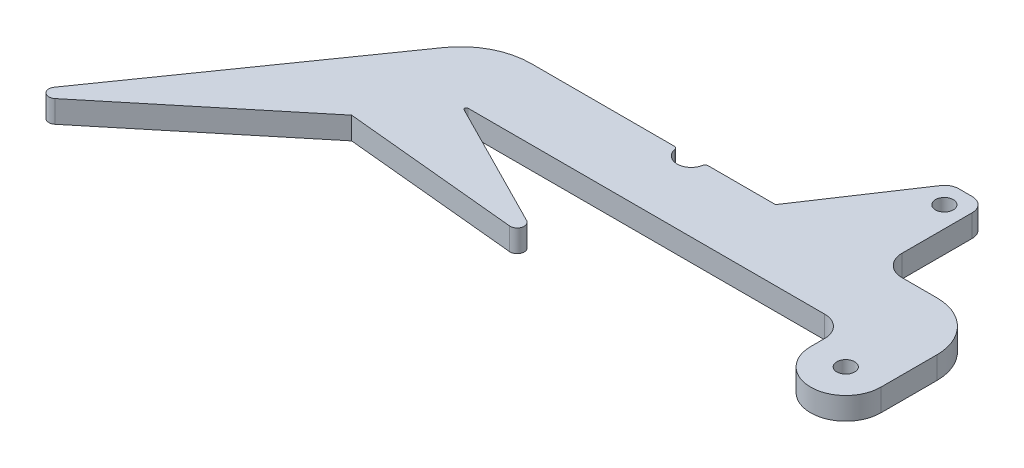
ISO-10303-21;
HEADER;
FILE_DESCRIPTION(('STEP AP214'),'2;1');
FILE_NAME('part.step','',(''),(''),'','','');
FILE_SCHEMA(('AUTOMOTIVE_DESIGN { 1 0 10303 214 1 1 1 1 }'));
ENDSEC;
DATA;
#1=APPLICATION_CONTEXT('core data for automotive mechanical design processes');
#2=APPLICATION_PROTOCOL_DEFINITION('international standard','automotive_design',2000,#1);
#3=PRODUCT_CONTEXT('',#1,'mechanical');
#4=PRODUCT('Part','Part','',(#3));
#5=PRODUCT_RELATED_PRODUCT_CATEGORY('part','',(#4));
#6=PRODUCT_DEFINITION_FORMATION('','',#4);
#7=PRODUCT_DEFINITION_CONTEXT('part definition',#1,'design');
#8=PRODUCT_DEFINITION('design','',#6,#7);
#9=PRODUCT_DEFINITION_SHAPE('','',#8);
#10=(LENGTH_UNIT() NAMED_UNIT(*) SI_UNIT(.MILLI.,.METRE.));
#11=(NAMED_UNIT(*) PLANE_ANGLE_UNIT() SI_UNIT($,.RADIAN.));
#12=(NAMED_UNIT(*) SI_UNIT($,.STERADIAN.) SOLID_ANGLE_UNIT());
#13=UNCERTAINTY_MEASURE_WITH_UNIT(LENGTH_MEASURE(1.E-05),#10,'distance_accuracy_value','');
#14=(GEOMETRIC_REPRESENTATION_CONTEXT(3) GLOBAL_UNCERTAINTY_ASSIGNED_CONTEXT((#13)) GLOBAL_UNIT_ASSIGNED_CONTEXT((#10,
#11,#12)) REPRESENTATION_CONTEXT('',''));
#15=CARTESIAN_POINT('',(0.,0.,0.));
#16=DIRECTION('',(0.,0.,1.));
#17=DIRECTION('',(1.,0.,0.));
#18=AXIS2_PLACEMENT_3D('',#15,#16,#17);
#19=CARTESIAN_POINT('',(-30.,3.175,0.));
#20=DIRECTION('',(0.,0.,1.));
#21=DIRECTION('',(1.,0.,0.));
#22=AXIS2_PLACEMENT_3D('',#19,#20,#21);
#23=PLANE('',#22);
#24=DIRECTION('',(-1.,0.,0.));
#25=VECTOR('',#24,1.);
#26=CARTESIAN_POINT('',(-30.,0.,0.));
#27=LINE('',#26,#25);
#28=CARTESIAN_POINT('',(-30.,0.,0.));
#29=VERTEX_POINT('',#28);
#30=CARTESIAN_POINT('',(-39.5505102572168,0.,0.));
#31=VERTEX_POINT('',#30);
#32=EDGE_CURVE('E413',#29,#31,#27,.T.);
#33=ORIENTED_EDGE('',*,*,#32,.T.);
#34=DIRECTION('',(0.,1.,0.));
#35=VECTOR('',#34,1.);
#36=CARTESIAN_POINT('',(-39.5505102572168,3.175,0.));
#37=LINE('',#36,#35);
#38=CARTESIAN_POINT('',(-39.5505102572168,3.175,0.));
#39=VERTEX_POINT('',#38);
#40=EDGE_CURVE('E218',#31,#39,#37,.T.);
#41=ORIENTED_EDGE('',*,*,#40,.T.);
#42=DIRECTION('',(-1.,0.,0.));
#43=VECTOR('',#42,1.);
#44=CARTESIAN_POINT('',(-30.,3.175,0.));
#45=LINE('',#44,#43);
#46=CARTESIAN_POINT('',(-30.,3.175,0.));
#47=VERTEX_POINT('',#46);
#48=EDGE_CURVE('E211',#47,#39,#45,.T.);
#49=ORIENTED_EDGE('',*,*,#48,.F.);
#50=DIRECTION('',(0.,-1.,0.));
#51=VECTOR('',#50,1.);
#52=CARTESIAN_POINT('',(-30.,3.175,0.));
#53=LINE('',#52,#51);
#54=EDGE_CURVE('E215',#47,#29,#53,.T.);
#55=ORIENTED_EDGE('',*,*,#54,.T.);
#56=EDGE_LOOP('',(#33,#41,#49,#55));
#57=FACE_BOUND('',#56,.T.);
#58=ADVANCED_FACE('F37',(#57),#23,.F.);
#59=CARTESIAN_POINT('',(-30.,3.175,0.));
#60=DIRECTION('',(0.832050294337844,0.,0.554700196225229));
#61=DIRECTION('',(0.554700196225229,0.,-0.832050294337844));
#62=AXIS2_PLACEMENT_3D('',#59,#60,#61);
#63=PLANE('',#62);
#64=DIRECTION('',(-0.554700196225229,0.,0.832050294337844));
#65=VECTOR('',#64,1.);
#66=CARTESIAN_POINT('',(-30.,0.,0.));
#67=LINE('',#66,#65);
#68=CARTESIAN_POINT('',(-20.5937330716997,0.,-14.1094003924505));
#69=VERTEX_POINT('',#68);
#70=EDGE_CURVE('E237',#69,#29,#67,.T.);
#71=ORIENTED_EDGE('',*,*,#70,.T.);
#72=ORIENTED_EDGE('',*,*,#54,.F.);
#73=DIRECTION('',(-0.554700196225229,0.,0.832050294337844));
#74=VECTOR('',#73,1.);
#75=CARTESIAN_POINT('',(-30.,3.175,0.));
#76=LINE('',#75,#74);
#77=CARTESIAN_POINT('',(-20.5937330716997,3.175,-14.1094003924505));
#78=VERTEX_POINT('',#77);
#79=EDGE_CURVE('E224',#78,#47,#76,.T.);
#80=ORIENTED_EDGE('',*,*,#79,.F.);
#81=DIRECTION('',(0.,-1.,0.));
#82=VECTOR('',#81,1.);
#83=CARTESIAN_POINT('',(-20.5937330716997,3.175,-14.1094003924505));
#84=LINE('',#83,#82);
#85=EDGE_CURVE('E326',#78,#69,#84,.T.);
#86=ORIENTED_EDGE('',*,*,#85,.T.);
#87=EDGE_LOOP('',(#71,#72,#80,#86));
#88=FACE_BOUND('',#87,.T.);
#89=ADVANCED_FACE('F235',(#88),#63,.F.);
#90=CARTESIAN_POINT('',(-44.4494897427832,3.175,0.));
#91=VERTEX_POINT('',#90);
#92=CARTESIAN_POINT('',(-64.7943294944825,3.175,0.));
#93=VERTEX_POINT('',#92);
#94=EDGE_CURVE('E221',#91,#93,#45,.T.);
#95=ORIENTED_EDGE('',*,*,#94,.F.);
#96=DIRECTION('',(0.,1.,0.));
#97=VECTOR('',#96,1.);
#98=CARTESIAN_POINT('',(-44.4494897427832,3.175,0.));
#99=LINE('',#98,#97);
#100=CARTESIAN_POINT('',(-44.4494897427832,0.,0.));
#101=VERTEX_POINT('',#100);
#102=EDGE_CURVE('E288',#91,#101,#99,.F.);
#103=ORIENTED_EDGE('',*,*,#102,.T.);
#104=CARTESIAN_POINT('',(-64.7943294944825,0.,0.));
#105=VERTEX_POINT('',#104);
#106=EDGE_CURVE('E411',#101,#105,#27,.T.);
#107=ORIENTED_EDGE('',*,*,#106,.T.);
#108=DIRECTION('',(0.,-1.,0.));
#109=VECTOR('',#108,1.);
#110=CARTESIAN_POINT('',(-64.7943294944825,3.175,0.));
#111=LINE('',#110,#109);
#112=EDGE_CURVE('E251',#105,#93,#111,.F.);
#113=ORIENTED_EDGE('',*,*,#112,.T.);
#114=EDGE_LOOP('',(#95,#103,#107,#113));
#115=FACE_BOUND('',#114,.T.);
#116=ADVANCED_FACE('F480',(#115),#23,.F.);
#117=CARTESIAN_POINT('',(-70.,3.175,0.));
#118=DIRECTION('',(0.819152044288993,0.,0.573576436351044));
#119=DIRECTION('',(0.573576436351044,0.,-0.819152044288994));
#120=AXIS2_PLACEMENT_3D('',#117,#118,#119);
#121=PLANE('',#120);
#122=DIRECTION('',(-0.573576436351044,0.,0.819152044288993));
#123=VECTOR('',#122,1.);
#124=CARTESIAN_POINT('',(-70.,3.175,0.));
#125=LINE('',#124,#123);
#126=CARTESIAN_POINT('',(-72.9858499373725,3.175,4.26423563648957));
#127=VERTEX_POINT('',#126);
#128=CARTESIAN_POINT('',(-95.810939635797,3.175,36.8618419930047));
#129=VERTEX_POINT('',#128);
#130=EDGE_CURVE('E220',#127,#129,#125,.T.);
#131=ORIENTED_EDGE('',*,*,#130,.F.);
#132=DIRECTION('',(0.,-1.,0.));
#133=VECTOR('',#132,1.);
#134=CARTESIAN_POINT('',(-72.9858499373725,3.175,4.26423563648957));
#135=LINE('',#134,#133);
#136=CARTESIAN_POINT('',(-72.9858499373725,0.,4.26423563648957));
#137=VERTEX_POINT('',#136);
#138=EDGE_CURVE('E238',#127,#137,#135,.T.);
#139=ORIENTED_EDGE('',*,*,#138,.T.);
#140=DIRECTION('',(-0.573576436351044,0.,0.819152044288993));
#141=VECTOR('',#140,1.);
#142=CARTESIAN_POINT('',(-70.,0.,0.));
#143=LINE('',#142,#141);
#144=CARTESIAN_POINT('',(-95.810939635797,0.,36.8618419930047));
#145=VERTEX_POINT('',#144);
#146=EDGE_CURVE('E370',#137,#145,#143,.T.);
#147=ORIENTED_EDGE('',*,*,#146,.T.);
#148=DIRECTION('',(0.,-1.,0.));
#149=VECTOR('',#148,1.);
#150=CARTESIAN_POINT('',(-95.810939635797,3.175,36.8618419930047));
#151=LINE('',#150,#149);
#152=EDGE_CURVE('E239',#129,#145,#151,.T.);
#153=ORIENTED_EDGE('',*,*,#152,.F.);
#154=EDGE_LOOP('',(#131,#139,#147,#153));
#155=FACE_BOUND('',#154,.T.);
#156=ADVANCED_FACE('F417',(#155),#121,.F.);
#157=CARTESIAN_POINT('',(-94.991787591508,3.175,37.4354184293557));
#158=DIRECTION('',(0.,-1.,0.));
#159=DIRECTION('',(0.,0.,-1.));
#160=AXIS2_PLACEMENT_3D('',#157,#158,#159);
#161=CYLINDRICAL_SURFACE('',#160,0.999999999999989);
#162=CARTESIAN_POINT('',(-94.991787591508,0.,37.4354184293557));
#163=DIRECTION('',(0.,1.,0.));
#164=DIRECTION('',(0.,0.,-1.));
#165=AXIS2_PLACEMENT_3D('',#162,#163,#164);
#166=CIRCLE('',#165,0.999999999999989);
#167=CARTESIAN_POINT('',(-94.3562273209506,0.,38.2074696857429));
#168=VERTEX_POINT('',#167);
#169=EDGE_CURVE('E364',#145,#168,#166,.T.);
#170=ORIENTED_EDGE('',*,*,#169,.T.);
#171=DIRECTION('',(0.,-1.,0.));
#172=VECTOR('',#171,1.);
#173=CARTESIAN_POINT('',(-94.3562273209506,3.175,38.2074696857429));
#174=LINE('',#173,#172);
#175=CARTESIAN_POINT('',(-94.3562273209506,3.175,38.2074696857429));
#176=VERTEX_POINT('',#175);
#177=EDGE_CURVE('E245',#176,#168,#174,.T.);
#178=ORIENTED_EDGE('',*,*,#177,.F.);
#179=CARTESIAN_POINT('',(-94.991787591508,3.175,37.4354184293557));
#180=DIRECTION('',(0.,1.,0.));
#181=DIRECTION('',(0.,0.,-1.));
#182=AXIS2_PLACEMENT_3D('',#179,#180,#181);
#183=CIRCLE('',#182,0.999999999999989);
#184=EDGE_CURVE('E420',#129,#176,#183,.T.);
#185=ORIENTED_EDGE('',*,*,#184,.F.);
#186=ORIENTED_EDGE('',*,*,#152,.T.);
#187=EDGE_LOOP('',(#170,#178,#185,#186));
#188=FACE_BOUND('',#187,.T.);
#189=ADVANCED_FACE('F419',(#188),#161,.T.);
#190=CARTESIAN_POINT('',(-94.3562273209506,3.175,38.2074696857429));
#191=DIRECTION('',(-0.635560270557382,0.,-0.772051256387183));
#192=DIRECTION('',(-0.772051256387183,0.,0.635560270557382));
#193=AXIS2_PLACEMENT_3D('',#190,#191,#192);
#194=PLANE('',#193);
#195=DIRECTION('',(0.772051256387183,0.,-0.635560270557382));
#196=VECTOR('',#195,1.);
#197=CARTESIAN_POINT('',(-94.3562273209506,0.,38.2074696857429));
#198=LINE('',#197,#196);
#199=CARTESIAN_POINT('',(-71.1946896293351,0.,19.1406615690215));
#200=VERTEX_POINT('',#199);
#201=EDGE_CURVE('E357',#168,#200,#198,.T.);
#202=ORIENTED_EDGE('',*,*,#201,.T.);
#203=DIRECTION('',(0.,-1.,0.));
#204=VECTOR('',#203,1.);
#205=CARTESIAN_POINT('',(-71.1946896293351,3.175,19.1406615690215));
#206=LINE('',#205,#204);
#207=CARTESIAN_POINT('',(-71.1946896293351,3.175,19.1406615690215));
#208=VERTEX_POINT('',#207);
#209=EDGE_CURVE('E348',#208,#200,#206,.T.);
#210=ORIENTED_EDGE('',*,*,#209,.F.);
#211=DIRECTION('',(0.772051256387183,0.,-0.635560270557382));
#212=VECTOR('',#211,1.);
#213=CARTESIAN_POINT('',(-94.3562273209506,3.175,38.2074696857429));
#214=LINE('',#213,#212);
#215=EDGE_CURVE('E358',#176,#208,#214,.T.);
#216=ORIENTED_EDGE('',*,*,#215,.F.);
#217=ORIENTED_EDGE('',*,*,#177,.T.);
#218=EDGE_LOOP('',(#202,#210,#216,#217));
#219=FACE_BOUND('',#218,.T.);
#220=ADVANCED_FACE('F355',(#219),#194,.F.);
#221=CARTESIAN_POINT('',(-71.1946896293351,3.175,19.1406615690215));
#222=DIRECTION('',(0.0965137016510914,0.,-0.995331655978852));
#223=DIRECTION('',(-0.995331655978852,0.,-0.0965137016510914));
#224=AXIS2_PLACEMENT_3D('',#221,#222,#223);
#225=PLANE('',#224);
#226=DIRECTION('',(0.995331655978852,0.,0.0965137016510914));
#227=VECTOR('',#226,1.);
#228=CARTESIAN_POINT('',(-71.1946896293351,0.,19.1406615690215));
#229=LINE('',#228,#227);
#230=CARTESIAN_POINT('',(-46.3113982298638,0.,21.5535041102988));
#231=VERTEX_POINT('',#230);
#232=EDGE_CURVE('E366',#200,#231,#229,.T.);
#233=ORIENTED_EDGE('',*,*,#232,.T.);
#234=DIRECTION('',(0.,-1.,0.));
#235=VECTOR('',#234,1.);
#236=CARTESIAN_POINT('',(-46.3113982298638,3.175,21.5535041102988));
#237=LINE('',#236,#235);
#238=CARTESIAN_POINT('',(-46.3113982298638,3.175,21.5535041102988));
#239=VERTEX_POINT('',#238);
#240=EDGE_CURVE('E345',#239,#231,#237,.T.);
#241=ORIENTED_EDGE('',*,*,#240,.F.);
#242=DIRECTION('',(0.995331655978852,0.,0.0965137016510914));
#243=VECTOR('',#242,1.);
#244=CARTESIAN_POINT('',(-71.1946896293351,3.175,19.1406615690215));
#245=LINE('',#244,#243);
#246=EDGE_CURVE('E422',#208,#239,#245,.T.);
#247=ORIENTED_EDGE('',*,*,#246,.F.);
#248=ORIENTED_EDGE('',*,*,#209,.T.);
#249=EDGE_LOOP('',(#233,#241,#247,#248));
#250=FACE_BOUND('',#249,.T.);
#251=ADVANCED_FACE('F469',(#250),#225,.F.);
#252=CARTESIAN_POINT('',(-46.2148845282127,3.175,20.5581724543199));
#253=DIRECTION('',(0.,-1.,0.));
#254=DIRECTION('',(0.,0.,-1.));
#255=AXIS2_PLACEMENT_3D('',#252,#253,#254);
#256=CYLINDRICAL_SURFACE('',#255,1.);
#257=CARTESIAN_POINT('',(-46.2148845282127,0.,20.5581724543199));
#258=DIRECTION('',(0.,1.,0.));
#259=DIRECTION('',(0.,0.,1.));
#260=AXIS2_PLACEMENT_3D('',#257,#258,#259);
#261=CIRCLE('',#260,1.);
#262=CARTESIAN_POINT('',(-45.7620418507201,0.,19.666582016147));
#263=VERTEX_POINT('',#262);
#264=EDGE_CURVE('E368',#231,#263,#261,.T.);
#265=ORIENTED_EDGE('',*,*,#264,.T.);
#266=DIRECTION('',(0.,-1.,0.));
#267=VECTOR('',#266,1.);
#268=CARTESIAN_POINT('',(-45.7620418507201,3.175,19.666582016147));
#269=LINE('',#268,#267);
#270=CARTESIAN_POINT('',(-45.7620418507201,3.175,19.666582016147));
#271=VERTEX_POINT('',#270);
#272=EDGE_CURVE('E342',#271,#263,#269,.T.);
#273=ORIENTED_EDGE('',*,*,#272,.F.);
#274=CARTESIAN_POINT('',(-46.2148845282127,3.175,20.5581724543199));
#275=DIRECTION('',(0.,1.,0.));
#276=DIRECTION('',(0.,0.,1.));
#277=AXIS2_PLACEMENT_3D('',#274,#275,#276);
#278=CIRCLE('',#277,1.);
#279=EDGE_CURVE('E427',#239,#271,#278,.T.);
#280=ORIENTED_EDGE('',*,*,#279,.F.);
#281=ORIENTED_EDGE('',*,*,#240,.T.);
#282=EDGE_LOOP('',(#265,#273,#280,#281));
#283=FACE_BOUND('',#282,.T.);
#284=ADVANCED_FACE('F465',(#283),#256,.T.);
#285=CARTESIAN_POINT('',(-45.7620418507201,3.175,19.666582016147));
#286=DIRECTION('',(-0.452842677492602,0.,0.891590438172893));
#287=DIRECTION('',(0.891590438172893,0.,0.452842677492602));
#288=AXIS2_PLACEMENT_3D('',#285,#286,#287);
#289=PLANE('',#288);
#290=DIRECTION('',(-0.891590438172893,0.,-0.452842677492602));
#291=VECTOR('',#290,1.);
#292=CARTESIAN_POINT('',(-45.7620418507201,0.,19.666582016147));
#293=LINE('',#292,#291);
#294=CARTESIAN_POINT('',(-63.8632534103154,0.,10.4728976095432));
#295=VERTEX_POINT('',#294);
#296=EDGE_CURVE('E375',#263,#295,#293,.T.);
#297=ORIENTED_EDGE('',*,*,#296,.T.);
#298=DIRECTION('',(0.,-1.,0.));
#299=VECTOR('',#298,1.);
#300=CARTESIAN_POINT('',(-63.8632534103154,3.175,10.4728976095432));
#301=LINE('',#300,#299);
#302=CARTESIAN_POINT('',(-63.8632534103154,3.175,10.4728976095432));
#303=VERTEX_POINT('',#302);
#304=EDGE_CURVE('E259',#295,#303,#301,.F.);
#305=ORIENTED_EDGE('',*,*,#304,.T.);
#306=DIRECTION('',(-0.891590438172893,0.,-0.452842677492602));
#307=VECTOR('',#306,1.);
#308=CARTESIAN_POINT('',(-45.7620418507201,3.175,19.666582016147));
#309=LINE('',#308,#307);
#310=EDGE_CURVE('E429',#271,#303,#309,.T.);
#311=ORIENTED_EDGE('',*,*,#310,.F.);
#312=ORIENTED_EDGE('',*,*,#272,.T.);
#313=EDGE_LOOP('',(#297,#305,#311,#312));
#314=FACE_BOUND('',#313,.T.);
#315=ADVANCED_FACE('F461',(#314),#289,.F.);
#316=CARTESIAN_POINT('',(-64.7943294944825,3.175,10.));
#317=DIRECTION('',(0.,0.,-1.));
#318=DIRECTION('',(-1.,0.,0.));
#319=AXIS2_PLACEMENT_3D('',#316,#317,#318);
#320=PLANE('',#319);
#321=DIRECTION('',(1.,0.,0.));
#322=VECTOR('',#321,1.);
#323=CARTESIAN_POINT('',(-64.7943294944825,0.,10.));
#324=LINE('',#323,#322);
#325=CARTESIAN_POINT('',(-63.7500427409423,0.,10.));
#326=VERTEX_POINT('',#325);
#327=CARTESIAN_POINT('',(-13.,0.,10.));
#328=VERTEX_POINT('',#327);
#329=EDGE_CURVE('E378',#326,#328,#324,.T.);
#330=ORIENTED_EDGE('',*,*,#329,.T.);
#331=DIRECTION('',(0.,-1.,0.));
#332=VECTOR('',#331,1.);
#333=CARTESIAN_POINT('',(-13.,3.175,10.));
#334=LINE('',#333,#332);
#335=CARTESIAN_POINT('',(-13.,3.175,10.));
#336=VERTEX_POINT('',#335);
#337=EDGE_CURVE('E268',#328,#336,#334,.F.);
#338=ORIENTED_EDGE('',*,*,#337,.T.);
#339=DIRECTION('',(1.,0.,0.));
#340=VECTOR('',#339,1.);
#341=CARTESIAN_POINT('',(-64.7943294944825,3.175,10.));
#342=LINE('',#341,#340);
#343=CARTESIAN_POINT('',(-63.7500427409423,3.175,10.));
#344=VERTEX_POINT('',#343);
#345=EDGE_CURVE('E432',#344,#336,#342,.T.);
#346=ORIENTED_EDGE('',*,*,#345,.F.);
#347=DIRECTION('',(0.,-1.,0.));
#348=VECTOR('',#347,1.);
#349=CARTESIAN_POINT('',(-63.7500427409423,0.,10.));
#350=LINE('',#349,#348);
#351=EDGE_CURVE('E256',#344,#326,#350,.T.);
#352=ORIENTED_EDGE('',*,*,#351,.T.);
#353=EDGE_LOOP('',(#330,#338,#346,#352));
#354=FACE_BOUND('',#353,.T.);
#355=ADVANCED_FACE('F452',(#354),#320,.F.);
#356=CARTESIAN_POINT('',(-10.,3.175,10.));
#357=DIRECTION('',(1.,0.,0.));
#358=DIRECTION('',(0.,0.,-1.));
#359=AXIS2_PLACEMENT_3D('',#356,#357,#358);
#360=PLANE('',#359);
#361=DIRECTION('',(0.,0.,1.));
#362=VECTOR('',#361,1.);
#363=CARTESIAN_POINT('',(-10.,3.175,10.));
#364=LINE('',#363,#362);
#365=CARTESIAN_POINT('',(-10.,3.175,13.));
#366=VERTEX_POINT('',#365);
#367=CARTESIAN_POINT('',(-10.,3.175,15.));
#368=VERTEX_POINT('',#367);
#369=EDGE_CURVE('E435',#366,#368,#364,.T.);
#370=ORIENTED_EDGE('',*,*,#369,.F.);
#371=DIRECTION('',(0.,-1.,0.));
#372=VECTOR('',#371,1.);
#373=CARTESIAN_POINT('',(-10.,0.,13.));
#374=LINE('',#373,#372);
#375=CARTESIAN_POINT('',(-10.,0.,13.));
#376=VERTEX_POINT('',#375);
#377=EDGE_CURVE('E265',#366,#376,#374,.T.);
#378=ORIENTED_EDGE('',*,*,#377,.T.);
#379=DIRECTION('',(0.,0.,1.));
#380=VECTOR('',#379,1.);
#381=CARTESIAN_POINT('',(-10.,0.,10.));
#382=LINE('',#381,#380);
#383=CARTESIAN_POINT('',(-10.,0.,15.));
#384=VERTEX_POINT('',#383);
#385=EDGE_CURVE('E381',#376,#384,#382,.T.);
#386=ORIENTED_EDGE('',*,*,#385,.T.);
#387=DIRECTION('',(0.,-1.,0.));
#388=VECTOR('',#387,1.);
#389=CARTESIAN_POINT('',(-10.,3.175,15.));
#390=LINE('',#389,#388);
#391=EDGE_CURVE('E339',#368,#384,#390,.T.);
#392=ORIENTED_EDGE('',*,*,#391,.F.);
#393=EDGE_LOOP('',(#370,#378,#386,#392));
#394=FACE_BOUND('',#393,.T.);
#395=ADVANCED_FACE('F444',(#394),#360,.F.);
#396=CARTESIAN_POINT('',(-5.,3.175,15.));
#397=DIRECTION('',(0.,-1.,0.));
#398=DIRECTION('',(0.,0.,-1.));
#399=AXIS2_PLACEMENT_3D('',#396,#397,#398);
#400=CYLINDRICAL_SURFACE('',#399,5.);
#401=CARTESIAN_POINT('',(-5.,0.,15.));
#402=DIRECTION('',(0.,1.,0.));
#403=DIRECTION('',(0.,0.,-1.));
#404=AXIS2_PLACEMENT_3D('',#401,#402,#403);
#405=CIRCLE('',#404,5.);
#406=CARTESIAN_POINT('',(0.,0.,15.));
#407=VERTEX_POINT('',#406);
#408=EDGE_CURVE('E383',#384,#407,#405,.T.);
#409=ORIENTED_EDGE('',*,*,#408,.T.);
#410=DIRECTION('',(0.,-1.,0.));
#411=VECTOR('',#410,1.);
#412=CARTESIAN_POINT('',(0.,3.175,15.));
#413=LINE('',#412,#411);
#414=CARTESIAN_POINT('',(0.,3.175,15.));
#415=VERTEX_POINT('',#414);
#416=EDGE_CURVE('E336',#415,#407,#413,.T.);
#417=ORIENTED_EDGE('',*,*,#416,.F.);
#418=CARTESIAN_POINT('',(-5.,3.175,15.));
#419=DIRECTION('',(0.,1.,0.));
#420=DIRECTION('',(0.,0.,-1.));
#421=AXIS2_PLACEMENT_3D('',#418,#419,#420);
#422=CIRCLE('',#421,5.);
#423=EDGE_CURVE('E402',#368,#415,#422,.T.);
#424=ORIENTED_EDGE('',*,*,#423,.F.);
#425=ORIENTED_EDGE('',*,*,#391,.T.);
#426=EDGE_LOOP('',(#409,#417,#424,#425));
#427=FACE_BOUND('',#426,.T.);
#428=ADVANCED_FACE('F440',(#427),#400,.T.);
#429=CARTESIAN_POINT('',(0.,3.175,0.));
#430=DIRECTION('',(-1.,0.,0.));
#431=DIRECTION('',(0.,0.,1.));
#432=AXIS2_PLACEMENT_3D('',#429,#430,#431);
#433=PLANE('',#432);
#434=DIRECTION('',(0.,0.,-1.));
#435=VECTOR('',#434,1.);
#436=CARTESIAN_POINT('',(0.,0.,0.));
#437=LINE('',#436,#435);
#438=CARTESIAN_POINT('',(0.,0.,7.));
#439=VERTEX_POINT('',#438);
#440=EDGE_CURVE('E320',#407,#439,#437,.T.);
#441=ORIENTED_EDGE('',*,*,#440,.T.);
#442=DIRECTION('',(0.,-1.,0.));
#443=VECTOR('',#442,1.);
#444=CARTESIAN_POINT('',(0.,3.175,7.));
#445=LINE('',#444,#443);
#446=CARTESIAN_POINT('',(0.,3.175,7.));
#447=VERTEX_POINT('',#446);
#448=EDGE_CURVE('E295',#439,#447,#445,.F.);
#449=ORIENTED_EDGE('',*,*,#448,.T.);
#450=DIRECTION('',(0.,0.,-1.));
#451=VECTOR('',#450,1.);
#452=CARTESIAN_POINT('',(0.,3.175,0.));
#453=LINE('',#452,#451);
#454=EDGE_CURVE('E397',#415,#447,#453,.T.);
#455=ORIENTED_EDGE('',*,*,#454,.F.);
#456=ORIENTED_EDGE('',*,*,#416,.T.);
#457=EDGE_LOOP('',(#441,#449,#455,#456));
#458=FACE_BOUND('',#457,.T.);
#459=ADVANCED_FACE('F388',(#458),#433,.F.);
#460=CARTESIAN_POINT('',(-15.,3.175,0.));
#461=DIRECTION('',(0.,0.,1.));
#462=DIRECTION('',(1.,0.,0.));
#463=AXIS2_PLACEMENT_3D('',#460,#461,#462);
#464=PLANE('',#463);
#465=DIRECTION('',(-1.,0.,0.));
#466=VECTOR('',#465,1.);
#467=CARTESIAN_POINT('',(-15.,0.,0.));
#468=LINE('',#467,#466);
#469=CARTESIAN_POINT('',(-7.,0.,0.));
#470=VERTEX_POINT('',#469);
#471=CARTESIAN_POINT('',(-12.,0.,0.));
#472=VERTEX_POINT('',#471);
#473=EDGE_CURVE('E316',#470,#472,#468,.T.);
#474=ORIENTED_EDGE('',*,*,#473,.T.);
#475=DIRECTION('',(0.,-1.,0.));
#476=VECTOR('',#475,1.);
#477=CARTESIAN_POINT('',(-12.,3.175,0.));
#478=LINE('',#477,#476);
#479=CARTESIAN_POINT('',(-12.,3.175,0.));
#480=VERTEX_POINT('',#479);
#481=EDGE_CURVE('E58',#472,#480,#478,.F.);
#482=ORIENTED_EDGE('',*,*,#481,.T.);
#483=DIRECTION('',(-1.,0.,0.));
#484=VECTOR('',#483,1.);
#485=CARTESIAN_POINT('',(-15.,3.175,0.));
#486=LINE('',#485,#484);
#487=CARTESIAN_POINT('',(-7.,3.175,0.));
#488=VERTEX_POINT('',#487);
#489=EDGE_CURVE('E396',#488,#480,#486,.T.);
#490=ORIENTED_EDGE('',*,*,#489,.F.);
#491=DIRECTION('',(0.,-1.,0.));
#492=VECTOR('',#491,1.);
#493=CARTESIAN_POINT('',(-7.,3.175,0.));
#494=LINE('',#493,#492);
#495=EDGE_CURVE('E290',#488,#470,#494,.T.);
#496=ORIENTED_EDGE('',*,*,#495,.T.);
#497=EDGE_LOOP('',(#474,#482,#490,#496));
#498=FACE_BOUND('',#497,.T.);
#499=ADVANCED_FACE('F398',(#498),#464,.F.);
#500=CARTESIAN_POINT('',(-15.,3.175,0.));
#501=DIRECTION('',(-1.,0.,0.));
#502=DIRECTION('',(0.,0.,1.));
#503=AXIS2_PLACEMENT_3D('',#500,#501,#502);
#504=PLANE('',#503);
#505=DIRECTION('',(0.,0.,-1.));
#506=VECTOR('',#505,1.);
#507=CARTESIAN_POINT('',(-15.,3.175,0.));
#508=LINE('',#507,#506);
#509=CARTESIAN_POINT('',(-15.,3.175,-3.));
#510=VERTEX_POINT('',#509);
#511=CARTESIAN_POINT('',(-15.,3.175,-13.));
#512=VERTEX_POINT('',#511);
#513=EDGE_CURVE('E309',#510,#512,#508,.T.);
#514=ORIENTED_EDGE('',*,*,#513,.F.);
#515=DIRECTION('',(0.,-1.,0.));
#516=VECTOR('',#515,1.);
#517=CARTESIAN_POINT('',(-15.,0.,-3.));
#518=LINE('',#517,#516);
#519=CARTESIAN_POINT('',(-15.,0.,-3.));
#520=VERTEX_POINT('',#519);
#521=EDGE_CURVE('E299',#510,#520,#518,.T.);
#522=ORIENTED_EDGE('',*,*,#521,.T.);
#523=DIRECTION('',(0.,0.,-1.));
#524=VECTOR('',#523,1.);
#525=CARTESIAN_POINT('',(-15.,0.,0.));
#526=LINE('',#525,#524);
#527=CARTESIAN_POINT('',(-15.,0.,-13.));
#528=VERTEX_POINT('',#527);
#529=EDGE_CURVE('E307',#520,#528,#526,.T.);
#530=ORIENTED_EDGE('',*,*,#529,.T.);
#531=DIRECTION('',(0.,-1.,0.));
#532=VECTOR('',#531,1.);
#533=CARTESIAN_POINT('',(-15.,3.175,-13.));
#534=LINE('',#533,#532);
#535=EDGE_CURVE('E334',#512,#528,#534,.T.);
#536=ORIENTED_EDGE('',*,*,#535,.F.);
#537=EDGE_LOOP('',(#514,#522,#530,#536));
#538=FACE_BOUND('',#537,.T.);
#539=ADVANCED_FACE('F305',(#538),#504,.F.);
#540=CARTESIAN_POINT('',(-17.,3.175,-13.));
#541=DIRECTION('',(0.,-1.,0.));
#542=DIRECTION('',(0.,0.,-1.));
#543=AXIS2_PLACEMENT_3D('',#540,#541,#542);
#544=CYLINDRICAL_SURFACE('',#543,2.);
#545=CARTESIAN_POINT('',(-17.,0.,-13.));
#546=DIRECTION('',(0.,1.,0.));
#547=DIRECTION('',(0.,0.,1.));
#548=AXIS2_PLACEMENT_3D('',#545,#546,#547);
#549=CIRCLE('',#548,2.);
#550=CARTESIAN_POINT('',(-17.,0.,-15.));
#551=VERTEX_POINT('',#550);
#552=EDGE_CURVE('E315',#528,#551,#549,.T.);
#553=ORIENTED_EDGE('',*,*,#552,.T.);
#554=DIRECTION('',(0.,-1.,0.));
#555=VECTOR('',#554,1.);
#556=CARTESIAN_POINT('',(-17.,3.175,-15.));
#557=LINE('',#556,#555);
#558=CARTESIAN_POINT('',(-17.,3.175,-15.));
#559=VERTEX_POINT('',#558);
#560=EDGE_CURVE('E331',#559,#551,#557,.T.);
#561=ORIENTED_EDGE('',*,*,#560,.F.);
#562=CARTESIAN_POINT('',(-17.,3.175,-13.));
#563=DIRECTION('',(0.,1.,0.));
#564=DIRECTION('',(0.,0.,1.));
#565=AXIS2_PLACEMENT_3D('',#562,#563,#564);
#566=CIRCLE('',#565,2.);
#567=EDGE_CURVE('E400',#512,#559,#566,.T.);
#568=ORIENTED_EDGE('',*,*,#567,.F.);
#569=ORIENTED_EDGE('',*,*,#535,.T.);
#570=EDGE_LOOP('',(#553,#561,#568,#569));
#571=FACE_BOUND('',#570,.T.);
#572=ADVANCED_FACE('F545',(#571),#544,.T.);
#573=CARTESIAN_POINT('',(-18.929632483024,3.175,-15.));
#574=DIRECTION('',(0.,0.,1.));
#575=DIRECTION('',(1.,0.,0.));
#576=AXIS2_PLACEMENT_3D('',#573,#574,#575);
#577=PLANE('',#576);
#578=DIRECTION('',(-1.,0.,0.));
#579=VECTOR('',#578,1.);
#580=CARTESIAN_POINT('',(-18.929632483024,0.,-15.));
#581=LINE('',#580,#579);
#582=CARTESIAN_POINT('',(-18.929632483024,0.,-15.));
#583=VERTEX_POINT('',#582);
#584=EDGE_CURVE('E318',#551,#583,#581,.T.);
#585=ORIENTED_EDGE('',*,*,#584,.T.);
#586=DIRECTION('',(0.,-1.,0.));
#587=VECTOR('',#586,1.);
#588=CARTESIAN_POINT('',(-18.929632483024,3.175,-15.));
#589=LINE('',#588,#587);
#590=CARTESIAN_POINT('',(-18.929632483024,3.175,-15.));
#591=VERTEX_POINT('',#590);
#592=EDGE_CURVE('E328',#591,#583,#589,.T.);
#593=ORIENTED_EDGE('',*,*,#592,.F.);
#594=DIRECTION('',(-1.,0.,0.));
#595=VECTOR('',#594,1.);
#596=CARTESIAN_POINT('',(-18.929632483024,3.175,-15.));
#597=LINE('',#596,#595);
#598=EDGE_CURVE('E407',#559,#591,#597,.T.);
#599=ORIENTED_EDGE('',*,*,#598,.F.);
#600=ORIENTED_EDGE('',*,*,#560,.T.);
#601=EDGE_LOOP('',(#585,#593,#599,#600));
#602=FACE_BOUND('',#601,.T.);
#603=ADVANCED_FACE('F537',(#602),#577,.F.);
#604=CARTESIAN_POINT('',(-18.929632483024,3.175,-13.));
#605=DIRECTION('',(0.,-1.,0.));
#606=DIRECTION('',(0.,0.,-1.));
#607=AXIS2_PLACEMENT_3D('',#604,#605,#606);
#608=CYLINDRICAL_SURFACE('',#607,2.);
#609=CARTESIAN_POINT('',(-18.929632483024,0.,-13.));
#610=DIRECTION('',(0.,1.,0.));
#611=DIRECTION('',(0.,0.,1.));
#612=AXIS2_PLACEMENT_3D('',#609,#610,#611);
#613=CIRCLE('',#612,2.);
#614=EDGE_CURVE('E233',#583,#69,#613,.T.);
#615=ORIENTED_EDGE('',*,*,#614,.T.);
#616=ORIENTED_EDGE('',*,*,#85,.F.);
#617=CARTESIAN_POINT('',(-18.929632483024,3.175,-13.));
#618=DIRECTION('',(0.,1.,0.));
#619=DIRECTION('',(0.,0.,1.));
#620=AXIS2_PLACEMENT_3D('',#617,#618,#619);
#621=CIRCLE('',#620,2.);
#622=EDGE_CURVE('E229',#591,#78,#621,.T.);
#623=ORIENTED_EDGE('',*,*,#622,.F.);
#624=ORIENTED_EDGE('',*,*,#592,.T.);
#625=EDGE_LOOP('',(#615,#616,#623,#624));
#626=FACE_BOUND('',#625,.T.);
#627=ADVANCED_FACE('F529',(#626),#608,.T.);
#628=CARTESIAN_POINT('',(-18.929632483024,3.175,-13.));
#629=DIRECTION('',(0.,1.,0.));
#630=DIRECTION('',(0.,0.,1.));
#631=AXIS2_PLACEMENT_3D('',#628,#629,#630);
#632=PLANE('',#631);
#633=ORIENTED_EDGE('',*,*,#454,.T.);
#634=CARTESIAN_POINT('',(-7.,3.175,7.));
#635=DIRECTION('',(0.,1.,0.));
#636=DIRECTION('',(0.,0.,1.));
#637=AXIS2_PLACEMENT_3D('',#634,#635,#636);
#638=CIRCLE('',#637,7.);
#639=EDGE_CURVE('E297',#447,#488,#638,.T.);
#640=ORIENTED_EDGE('',*,*,#639,.T.);
#641=ORIENTED_EDGE('',*,*,#489,.T.);
#642=CARTESIAN_POINT('',(-12.,3.175,-3.));
#643=DIRECTION('',(0.,1.,0.));
#644=DIRECTION('',(0.,0.,1.));
#645=AXIS2_PLACEMENT_3D('',#642,#643,#644);
#646=CIRCLE('',#645,3.);
#647=EDGE_CURVE('E11',#480,#510,#646,.F.);
#648=ORIENTED_EDGE('',*,*,#647,.T.);
#649=ORIENTED_EDGE('',*,*,#513,.T.);
#650=ORIENTED_EDGE('',*,*,#567,.T.);
#651=ORIENTED_EDGE('',*,*,#598,.T.);
#652=ORIENTED_EDGE('',*,*,#622,.T.);
#653=ORIENTED_EDGE('',*,*,#79,.T.);
#654=ORIENTED_EDGE('',*,*,#48,.T.);
#655=CARTESIAN_POINT('',(-39.5505102572168,3.175,0.500000000000002));
#656=DIRECTION('',(0.,1.,0.));
#657=DIRECTION('',(0.,0.,1.));
#658=AXIS2_PLACEMENT_3D('',#655,#656,#657);
#659=CIRCLE('',#658,0.5);
#660=CARTESIAN_POINT('',(-40.0404082057735,3.175,0.400000000000002));
#661=VERTEX_POINT('',#660);
#662=EDGE_CURVE('E277',#39,#661,#659,.T.);
#663=ORIENTED_EDGE('',*,*,#662,.T.);
#664=CARTESIAN_POINT('',(-42.,3.175,0.));
#665=DIRECTION('',(0.,1.,0.));
#666=DIRECTION('',(0.,0.,-1.));
#667=AXIS2_PLACEMENT_3D('',#664,#665,#666);
#668=CIRCLE('',#667,2.);
#669=CARTESIAN_POINT('',(-43.9595917942265,3.175,0.400000000000003));
#670=VERTEX_POINT('',#669);
#671=EDGE_CURVE('E510',#670,#661,#668,.T.);
#672=ORIENTED_EDGE('',*,*,#671,.F.);
#673=CARTESIAN_POINT('',(-44.4494897427832,3.175,0.500000000000003));
#674=DIRECTION('',(0.,1.,0.));
#675=DIRECTION('',(0.,0.,1.));
#676=AXIS2_PLACEMENT_3D('',#673,#674,#675);
#677=CIRCLE('',#676,0.5);
#678=EDGE_CURVE('E275',#670,#91,#677,.T.);
#679=ORIENTED_EDGE('',*,*,#678,.T.);
#680=ORIENTED_EDGE('',*,*,#94,.T.);
#681=CARTESIAN_POINT('',(-64.7943294944825,3.175,10.));
#682=DIRECTION('',(0.,1.,0.));
#683=DIRECTION('',(0.,0.,1.));
#684=AXIS2_PLACEMENT_3D('',#681,#682,#683);
#685=CIRCLE('',#684,10.);
#686=EDGE_CURVE('E254',#93,#127,#685,.T.);
#687=ORIENTED_EDGE('',*,*,#686,.T.);
#688=ORIENTED_EDGE('',*,*,#130,.T.);
#689=ORIENTED_EDGE('',*,*,#184,.T.);
#690=ORIENTED_EDGE('',*,*,#215,.T.);
#691=ORIENTED_EDGE('',*,*,#246,.T.);
#692=ORIENTED_EDGE('',*,*,#279,.T.);
#693=ORIENTED_EDGE('',*,*,#310,.T.);
#694=CARTESIAN_POINT('',(-63.7500427409423,3.175,10.25));
#695=DIRECTION('',(0.,1.,0.));
#696=DIRECTION('',(0.,0.,1.));
#697=AXIS2_PLACEMENT_3D('',#694,#695,#696);
#698=CIRCLE('',#697,0.25);
#699=EDGE_CURVE('E263',#303,#344,#698,.F.);
#700=ORIENTED_EDGE('',*,*,#699,.T.);
#701=ORIENTED_EDGE('',*,*,#345,.T.);
#702=CARTESIAN_POINT('',(-13.,3.175,13.));
#703=DIRECTION('',(0.,1.,0.));
#704=DIRECTION('',(0.,0.,1.));
#705=AXIS2_PLACEMENT_3D('',#702,#703,#704);
#706=CIRCLE('',#705,3.);
#707=EDGE_CURVE('E272',#336,#366,#706,.F.);
#708=ORIENTED_EDGE('',*,*,#707,.T.);
#709=ORIENTED_EDGE('',*,*,#369,.T.);
#710=ORIENTED_EDGE('',*,*,#423,.T.);
#711=EDGE_LOOP('',(#633,#640,#641,#648,#649,#650,#651,#652,#653,#654,#663,#672,#679,#680,#687,
#688,#689,#690,#691,#692,#693,#700,#701,#708,#709,#710));
#712=FACE_BOUND('',#711,.T.);
#713=CARTESIAN_POINT('',(-5.,3.175,15.));
#714=DIRECTION('',(0.,1.,0.));
#715=DIRECTION('',(0.,0.,1.));
#716=AXIS2_PLACEMENT_3D('',#713,#714,#715);
#717=CIRCLE('',#716,1.27);
#718=CARTESIAN_POINT('',(-5.,3.175,16.27));
#719=VERTEX_POINT('',#718);
#720=EDGE_CURVE('E517',#719,#719,#717,.T.);
#721=ORIENTED_EDGE('',*,*,#720,.F.);
#722=EDGE_LOOP('',(#721));
#723=FACE_BOUND('',#722,.T.);
#724=CARTESIAN_POINT('',(-17.964816241512,3.175,-12.));
#725=DIRECTION('',(0.,1.,0.));
#726=DIRECTION('',(0.,0.,1.));
#727=AXIS2_PLACEMENT_3D('',#724,#725,#726);
#728=CIRCLE('',#727,1.27);
#729=CARTESIAN_POINT('',(-17.964816241512,3.175,-10.73));
#730=VERTEX_POINT('',#729);
#731=EDGE_CURVE('E513',#730,#730,#728,.T.);
#732=ORIENTED_EDGE('',*,*,#731,.F.);
#733=EDGE_LOOP('',(#732));
#734=FACE_BOUND('',#733,.T.);
#735=ADVANCED_FACE('F226',(#712,#723,#734),#632,.T.);
#736=CARTESIAN_POINT('',(-18.929632483024,0.,-13.));
#737=DIRECTION('',(0.,1.,0.));
#738=DIRECTION('',(0.,0.,1.));
#739=AXIS2_PLACEMENT_3D('',#736,#737,#738);
#740=PLANE('',#739);
#741=CARTESIAN_POINT('',(-5.,0.,15.));
#742=DIRECTION('',(0.,1.,0.));
#743=DIRECTION('',(0.,0.,1.));
#744=AXIS2_PLACEMENT_3D('',#741,#742,#743);
#745=CIRCLE('',#744,1.27);
#746=CARTESIAN_POINT('',(-5.,0.,16.27));
#747=VERTEX_POINT('',#746);
#748=EDGE_CURVE('E412',#747,#747,#745,.F.);
#749=ORIENTED_EDGE('',*,*,#748,.F.);
#750=EDGE_LOOP('',(#749));
#751=FACE_BOUND('',#750,.T.);
#752=CARTESIAN_POINT('',(-17.964816241512,0.,-12.));
#753=DIRECTION('',(0.,1.,0.));
#754=DIRECTION('',(0.,0.,1.));
#755=AXIS2_PLACEMENT_3D('',#752,#753,#754);
#756=CIRCLE('',#755,1.27);
#757=CARTESIAN_POINT('',(-17.964816241512,0.,-10.73));
#758=VERTEX_POINT('',#757);
#759=EDGE_CURVE('E509',#758,#758,#756,.F.);
#760=ORIENTED_EDGE('',*,*,#759,.F.);
#761=EDGE_LOOP('',(#760));
#762=FACE_BOUND('',#761,.T.);
#763=ORIENTED_EDGE('',*,*,#473,.F.);
#764=CARTESIAN_POINT('',(-7.,0.,7.));
#765=DIRECTION('',(0.,1.,0.));
#766=DIRECTION('',(0.,0.,1.));
#767=AXIS2_PLACEMENT_3D('',#764,#765,#766);
#768=CIRCLE('',#767,7.);
#769=EDGE_CURVE('E293',#470,#439,#768,.F.);
#770=ORIENTED_EDGE('',*,*,#769,.T.);
#771=ORIENTED_EDGE('',*,*,#440,.F.);
#772=ORIENTED_EDGE('',*,*,#408,.F.);
#773=ORIENTED_EDGE('',*,*,#385,.F.);
#774=CARTESIAN_POINT('',(-13.,0.,13.));
#775=DIRECTION('',(0.,1.,0.));
#776=DIRECTION('',(0.,0.,1.));
#777=AXIS2_PLACEMENT_3D('',#774,#775,#776);
#778=CIRCLE('',#777,3.);
#779=EDGE_CURVE('E270',#376,#328,#778,.T.);
#780=ORIENTED_EDGE('',*,*,#779,.T.);
#781=ORIENTED_EDGE('',*,*,#329,.F.);
#782=CARTESIAN_POINT('',(-63.7500427409423,0.,10.25));
#783=DIRECTION('',(0.,1.,0.));
#784=DIRECTION('',(0.,0.,1.));
#785=AXIS2_PLACEMENT_3D('',#782,#783,#784);
#786=CIRCLE('',#785,0.25);
#787=EDGE_CURVE('E261',#326,#295,#786,.T.);
#788=ORIENTED_EDGE('',*,*,#787,.T.);
#789=ORIENTED_EDGE('',*,*,#296,.F.);
#790=ORIENTED_EDGE('',*,*,#264,.F.);
#791=ORIENTED_EDGE('',*,*,#232,.F.);
#792=ORIENTED_EDGE('',*,*,#201,.F.);
#793=ORIENTED_EDGE('',*,*,#169,.F.);
#794=ORIENTED_EDGE('',*,*,#146,.F.);
#795=CARTESIAN_POINT('',(-64.7943294944825,0.,10.));
#796=DIRECTION('',(0.,1.,0.));
#797=DIRECTION('',(0.,0.,1.));
#798=AXIS2_PLACEMENT_3D('',#795,#796,#797);
#799=CIRCLE('',#798,10.);
#800=EDGE_CURVE('E242',#137,#105,#799,.F.);
#801=ORIENTED_EDGE('',*,*,#800,.T.);
#802=ORIENTED_EDGE('',*,*,#106,.F.);
#803=CARTESIAN_POINT('',(-44.4494897427832,0.,0.500000000000003));
#804=DIRECTION('',(0.,1.,0.));
#805=DIRECTION('',(0.,0.,1.));
#806=AXIS2_PLACEMENT_3D('',#803,#804,#805);
#807=CIRCLE('',#806,0.5);
#808=CARTESIAN_POINT('',(-43.9595917942265,0.,0.400000000000003));
#809=VERTEX_POINT('',#808);
#810=EDGE_CURVE('E284',#101,#809,#807,.F.);
#811=ORIENTED_EDGE('',*,*,#810,.T.);
#812=CARTESIAN_POINT('',(-42.,0.,0.));
#813=DIRECTION('',(0.,1.,0.));
#814=DIRECTION('',(0.,0.,-1.));
#815=AXIS2_PLACEMENT_3D('',#812,#813,#814);
#816=CIRCLE('',#815,2.);
#817=CARTESIAN_POINT('',(-40.0404082057735,0.,0.400000000000002));
#818=VERTEX_POINT('',#817);
#819=EDGE_CURVE('E502',#809,#818,#816,.T.);
#820=ORIENTED_EDGE('',*,*,#819,.T.);
#821=CARTESIAN_POINT('',(-39.5505102572168,0.,0.500000000000002));
#822=DIRECTION('',(0.,1.,0.));
#823=DIRECTION('',(0.,0.,1.));
#824=AXIS2_PLACEMENT_3D('',#821,#822,#823);
#825=CIRCLE('',#824,0.5);
#826=EDGE_CURVE('E286',#818,#31,#825,.F.);
#827=ORIENTED_EDGE('',*,*,#826,.T.);
#828=ORIENTED_EDGE('',*,*,#32,.F.);
#829=ORIENTED_EDGE('',*,*,#70,.F.);
#830=ORIENTED_EDGE('',*,*,#614,.F.);
#831=ORIENTED_EDGE('',*,*,#584,.F.);
#832=ORIENTED_EDGE('',*,*,#552,.F.);
#833=ORIENTED_EDGE('',*,*,#529,.F.);
#834=CARTESIAN_POINT('',(-12.,0.,-3.));
#835=DIRECTION('',(0.,1.,0.));
#836=DIRECTION('',(0.,0.,1.));
#837=AXIS2_PLACEMENT_3D('',#834,#835,#836);
#838=CIRCLE('',#837,3.);
#839=EDGE_CURVE('E45',#520,#472,#838,.T.);
#840=ORIENTED_EDGE('',*,*,#839,.T.);
#841=EDGE_LOOP('',(#763,#770,#771,#772,#773,#780,#781,#788,#789,#790,#791,#792,#793,#794,#801,
#802,#811,#820,#827,#828,#829,#830,#831,#832,#833,#840));
#842=FACE_BOUND('',#841,.T.);
#843=ADVANCED_FACE('F313',(#751,#762,#842),#740,.F.);
#844=CARTESIAN_POINT('',(-17.964816241512,-0.00100000000000013,-12.));
#845=DIRECTION('',(0.,1.,0.));
#846=DIRECTION('',(0.,0.,1.));
#847=AXIS2_PLACEMENT_3D('',#844,#845,#846);
#848=CYLINDRICAL_SURFACE('',#847,1.27);
#849=ORIENTED_EDGE('',*,*,#731,.T.);
#850=EDGE_LOOP('',(#849));
#851=FACE_BOUND('',#850,.T.);
#852=ORIENTED_EDGE('',*,*,#759,.T.);
#853=EDGE_LOOP('',(#852));
#854=FACE_BOUND('',#853,.T.);
#855=ADVANCED_FACE('F525',(#851,#854),#848,.F.);
#856=CARTESIAN_POINT('',(-5.,-0.00100000000000013,15.));
#857=DIRECTION('',(0.,1.,0.));
#858=DIRECTION('',(0.,0.,1.));
#859=AXIS2_PLACEMENT_3D('',#856,#857,#858);
#860=CYLINDRICAL_SURFACE('',#859,1.27);
#861=ORIENTED_EDGE('',*,*,#720,.T.);
#862=EDGE_LOOP('',(#861));
#863=FACE_BOUND('',#862,.T.);
#864=ORIENTED_EDGE('',*,*,#748,.T.);
#865=EDGE_LOOP('',(#864));
#866=FACE_BOUND('',#865,.T.);
#867=ADVANCED_FACE('F619',(#863,#866),#860,.F.);
#868=CARTESIAN_POINT('',(-42.,0.,0.));
#869=DIRECTION('',(0.,1.,0.));
#870=DIRECTION('',(0.,0.,1.));
#871=AXIS2_PLACEMENT_3D('',#868,#869,#870);
#872=CYLINDRICAL_SURFACE('',#871,2.);
#873=ORIENTED_EDGE('',*,*,#671,.T.);
#874=DIRECTION('',(0.,1.,0.));
#875=VECTOR('',#874,1.);
#876=CARTESIAN_POINT('',(-40.0404082057735,0.,0.400000000000002));
#877=LINE('',#876,#875);
#878=EDGE_CURVE('E282',#661,#818,#877,.F.);
#879=ORIENTED_EDGE('',*,*,#878,.T.);
#880=ORIENTED_EDGE('',*,*,#819,.F.);
#881=DIRECTION('',(0.,1.,0.));
#882=VECTOR('',#881,1.);
#883=CARTESIAN_POINT('',(-43.9595917942265,0.,0.400000000000002));
#884=LINE('',#883,#882);
#885=EDGE_CURVE('E279',#809,#670,#884,.T.);
#886=ORIENTED_EDGE('',*,*,#885,.T.);
#887=EDGE_LOOP('',(#873,#879,#880,#886));
#888=FACE_BOUND('',#887,.T.);
#889=ADVANCED_FACE('F506',(#888),#872,.F.);
#890=CARTESIAN_POINT('',(-64.7943294944825,3.175,10.));
#891=DIRECTION('',(0.,-1.,0.));
#892=DIRECTION('',(0.,0.,-1.));
#893=AXIS2_PLACEMENT_3D('',#890,#891,#892);
#894=CYLINDRICAL_SURFACE('',#893,10.);
#895=ORIENTED_EDGE('',*,*,#686,.F.);
#896=ORIENTED_EDGE('',*,*,#112,.F.);
#897=ORIENTED_EDGE('',*,*,#800,.F.);
#898=ORIENTED_EDGE('',*,*,#138,.F.);
#899=EDGE_LOOP('',(#895,#896,#897,#898));
#900=FACE_BOUND('',#899,.T.);
#901=ADVANCED_FACE('F645',(#900),#894,.T.);
#902=CARTESIAN_POINT('',(-63.7500427409423,3.175,10.25));
#903=DIRECTION('',(0.,1.,0.));
#904=DIRECTION('',(0.,0.,1.));
#905=AXIS2_PLACEMENT_3D('',#902,#903,#904);
#906=CYLINDRICAL_SURFACE('',#905,0.25);
#907=ORIENTED_EDGE('',*,*,#699,.F.);
#908=ORIENTED_EDGE('',*,*,#304,.F.);
#909=ORIENTED_EDGE('',*,*,#787,.F.);
#910=ORIENTED_EDGE('',*,*,#351,.F.);
#911=EDGE_LOOP('',(#907,#908,#909,#910));
#912=FACE_BOUND('',#911,.T.);
#913=ADVANCED_FACE('F458',(#912),#906,.F.);
#914=CARTESIAN_POINT('',(-13.,3.175,13.));
#915=DIRECTION('',(0.,1.,0.));
#916=DIRECTION('',(0.,0.,1.));
#917=AXIS2_PLACEMENT_3D('',#914,#915,#916);
#918=CYLINDRICAL_SURFACE('',#917,3.);
#919=ORIENTED_EDGE('',*,*,#707,.F.);
#920=ORIENTED_EDGE('',*,*,#337,.F.);
#921=ORIENTED_EDGE('',*,*,#779,.F.);
#922=ORIENTED_EDGE('',*,*,#377,.F.);
#923=EDGE_LOOP('',(#919,#920,#921,#922));
#924=FACE_BOUND('',#923,.T.);
#925=ADVANCED_FACE('F448',(#924),#918,.F.);
#926=CARTESIAN_POINT('',(-39.5505102572168,0.,0.500000000000002));
#927=DIRECTION('',(0.,1.,0.));
#928=DIRECTION('',(0.,0.,1.));
#929=AXIS2_PLACEMENT_3D('',#926,#927,#928);
#930=CYLINDRICAL_SURFACE('',#929,0.5);
#931=ORIENTED_EDGE('',*,*,#826,.F.);
#932=ORIENTED_EDGE('',*,*,#878,.F.);
#933=ORIENTED_EDGE('',*,*,#662,.F.);
#934=ORIENTED_EDGE('',*,*,#40,.F.);
#935=EDGE_LOOP('',(#931,#932,#933,#934));
#936=FACE_BOUND('',#935,.T.);
#937=ADVANCED_FACE('F666',(#936),#930,.T.);
#938=CARTESIAN_POINT('',(-44.4494897427832,0.,0.500000000000003));
#939=DIRECTION('',(0.,1.,0.));
#940=DIRECTION('',(0.,0.,1.));
#941=AXIS2_PLACEMENT_3D('',#938,#939,#940);
#942=CYLINDRICAL_SURFACE('',#941,0.5);
#943=ORIENTED_EDGE('',*,*,#810,.F.);
#944=ORIENTED_EDGE('',*,*,#102,.F.);
#945=ORIENTED_EDGE('',*,*,#678,.F.);
#946=ORIENTED_EDGE('',*,*,#885,.F.);
#947=EDGE_LOOP('',(#943,#944,#945,#946));
#948=FACE_BOUND('',#947,.T.);
#949=ADVANCED_FACE('F498',(#948),#942,.T.);
#950=CARTESIAN_POINT('',(-7.,3.175,7.));
#951=DIRECTION('',(0.,-1.,0.));
#952=DIRECTION('',(0.,0.,-1.));
#953=AXIS2_PLACEMENT_3D('',#950,#951,#952);
#954=CYLINDRICAL_SURFACE('',#953,7.);
#955=ORIENTED_EDGE('',*,*,#639,.F.);
#956=ORIENTED_EDGE('',*,*,#448,.F.);
#957=ORIENTED_EDGE('',*,*,#769,.F.);
#958=ORIENTED_EDGE('',*,*,#495,.F.);
#959=EDGE_LOOP('',(#955,#956,#957,#958));
#960=FACE_BOUND('',#959,.T.);
#961=ADVANCED_FACE('F394',(#960),#954,.T.);
#962=CARTESIAN_POINT('',(-12.,3.175,-3.));
#963=DIRECTION('',(0.,1.,0.));
#964=DIRECTION('',(0.,0.,1.));
#965=AXIS2_PLACEMENT_3D('',#962,#963,#964);
#966=CYLINDRICAL_SURFACE('',#965,3.);
#967=ORIENTED_EDGE('',*,*,#647,.F.);
#968=ORIENTED_EDGE('',*,*,#481,.F.);
#969=ORIENTED_EDGE('',*,*,#839,.F.);
#970=ORIENTED_EDGE('',*,*,#521,.F.);
#971=EDGE_LOOP('',(#967,#968,#969,#970));
#972=FACE_BOUND('',#971,.T.);
#973=ADVANCED_FACE('F39',(#972),#966,.F.);
#974=CLOSED_SHELL('',(#58,#89,#116,#156,#189,#220,#251,#284,#315,#355,#395,#428,#459,#499,#539,
#572,#603,#627,#735,#843,#855,#867,#889,#901,#913,#925,#937,#949,#961,#973));
#975=MANIFOLD_SOLID_BREP('B2',#974);
#976=ADVANCED_BREP_SHAPE_REPRESENTATION('',(#18,#975),#14);
#977=SHAPE_DEFINITION_REPRESENTATION(#9,#976);
ENDSEC;
END-ISO-10303-21;
